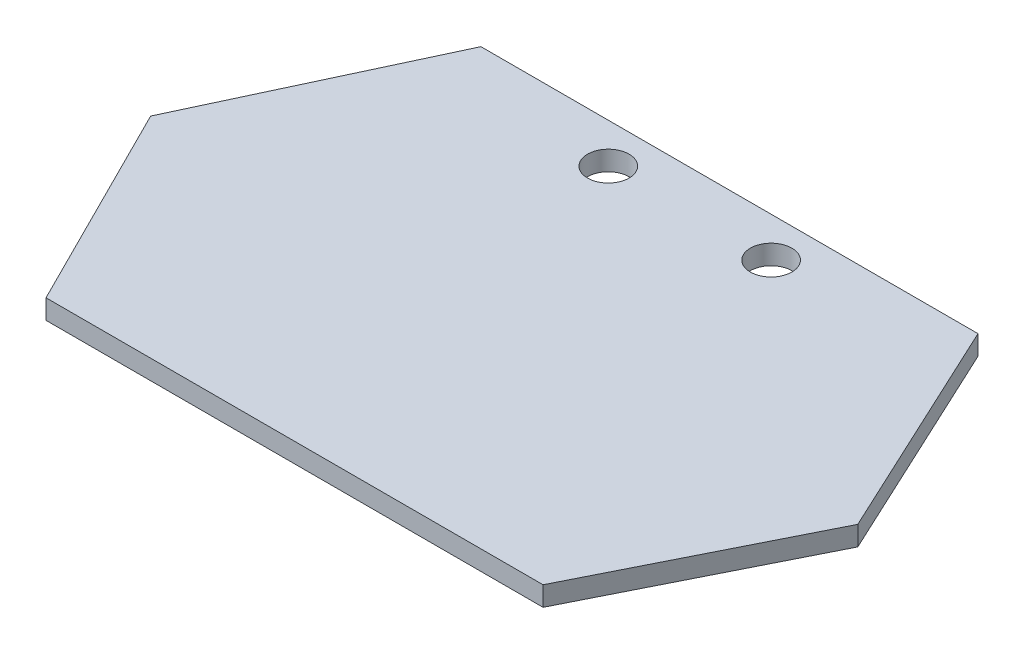
ISO-10303-21;
HEADER;
FILE_DESCRIPTION(('STEP AP214'),'2;1');
FILE_NAME('part.step','',(''),(''),'','','');
FILE_SCHEMA(('AUTOMOTIVE_DESIGN { 1 0 10303 214 1 1 1 1 }'));
ENDSEC;
DATA;
#1=APPLICATION_CONTEXT('core data for automotive mechanical design processes');
#2=APPLICATION_PROTOCOL_DEFINITION('international standard','automotive_design',2000,#1);
#3=PRODUCT_CONTEXT('',#1,'mechanical');
#4=PRODUCT('Part','Part','',(#3));
#5=PRODUCT_RELATED_PRODUCT_CATEGORY('part','',(#4));
#6=PRODUCT_DEFINITION_FORMATION('','',#4);
#7=PRODUCT_DEFINITION_CONTEXT('part definition',#1,'design');
#8=PRODUCT_DEFINITION('design','',#6,#7);
#9=PRODUCT_DEFINITION_SHAPE('','',#8);
#10=(LENGTH_UNIT() NAMED_UNIT(*) SI_UNIT(.MILLI.,.METRE.));
#11=(NAMED_UNIT(*) PLANE_ANGLE_UNIT() SI_UNIT($,.RADIAN.));
#12=(NAMED_UNIT(*) SI_UNIT($,.STERADIAN.) SOLID_ANGLE_UNIT());
#13=UNCERTAINTY_MEASURE_WITH_UNIT(LENGTH_MEASURE(1.E-05),#10,'distance_accuracy_value','');
#14=(GEOMETRIC_REPRESENTATION_CONTEXT(3) GLOBAL_UNCERTAINTY_ASSIGNED_CONTEXT((#13)) GLOBAL_UNIT_ASSIGNED_CONTEXT((#10,
#11,#12)) REPRESENTATION_CONTEXT('',''));
#15=CARTESIAN_POINT('',(0.,0.,0.));
#16=DIRECTION('',(0.,0.,1.));
#17=DIRECTION('',(1.,0.,0.));
#18=AXIS2_PLACEMENT_3D('',#15,#16,#17);
#19=CARTESIAN_POINT('',(0.,1.,0.));
#20=DIRECTION('',(0.,-1.,0.));
#21=DIRECTION('',(0.,0.,-1.));
#22=AXIS2_PLACEMENT_3D('',#19,#20,#21);
#23=PLANE('',#22);
#24=CARTESIAN_POINT('',(-3.78708882783882,1.,-12.6218461538462));
#25=DIRECTION('',(0.,1.,0.));
#26=DIRECTION('',(0.,0.,1.));
#27=AXIS2_PLACEMENT_3D('',#24,#25,#26);
#28=CIRCLE('',#27,1.06045);
#29=CARTESIAN_POINT('',(-3.78708882783882,1.,-11.5613961538462));
#30=VERTEX_POINT('',#29);
#31=EDGE_CURVE('E121',#30,#30,#28,.T.);
#32=ORIENTED_EDGE('',*,*,#31,.F.);
#33=EDGE_LOOP('',(#32));
#34=FACE_BOUND('',#33,.T.);
#35=DIRECTION('',(-0.422618261740698,0.,0.906307787036651));
#36=VECTOR('',#35,1.);
#37=CARTESIAN_POINT('',(-17.6950907519457,1.,-3.14373725848069));
#38=LINE('',#37,#36);
#39=CARTESIAN_POINT('',(-12.3278388278388,1.,-14.6538461538462));
#40=VERTEX_POINT('',#39);
#41=CARTESIAN_POINT('',(-17.6950907519457,1.,-3.14373725848069));
#42=VERTEX_POINT('',#41);
#43=EDGE_CURVE('E129',#40,#42,#38,.T.);
#44=ORIENTED_EDGE('',*,*,#43,.T.);
#45=DIRECTION('',(0.447868106614323,0.,0.89409963599014));
#46=VECTOR('',#45,1.);
#47=CARTESIAN_POINT('',(-12.3278388278388,1.,7.57115384615384));
#48=LINE('',#47,#46);
#49=CARTESIAN_POINT('',(-12.3278388278388,1.,7.57115384615384));
#50=VERTEX_POINT('',#49);
#51=EDGE_CURVE('E86',#42,#50,#48,.T.);
#52=ORIENTED_EDGE('',*,*,#51,.T.);
#53=DIRECTION('',(1.,0.,0.));
#54=VECTOR('',#53,1.);
#55=CARTESIAN_POINT('',(0.37216117216118,1.,7.57115384615384));
#56=LINE('',#55,#54);
#57=CARTESIAN_POINT('',(13.0721611721612,1.,7.57115384615384));
#58=VERTEX_POINT('',#57);
#59=EDGE_CURVE('E99',#50,#58,#56,.T.);
#60=ORIENTED_EDGE('',*,*,#59,.T.);
#61=DIRECTION('',(0.447868106614323,0.,-0.89409963599014));
#62=VECTOR('',#61,1.);
#63=CARTESIAN_POINT('',(18.439413096268,1.,-3.14373725848069));
#64=LINE('',#63,#62);
#65=CARTESIAN_POINT('',(18.439413096268,1.,-3.14373725848069));
#66=VERTEX_POINT('',#65);
#67=EDGE_CURVE('E93',#58,#66,#64,.T.);
#68=ORIENTED_EDGE('',*,*,#67,.T.);
#69=DIRECTION('',(-0.422618261740697,0.,-0.906307787036651));
#70=VECTOR('',#69,1.);
#71=CARTESIAN_POINT('',(13.0721611721612,1.,-14.6538461538462));
#72=LINE('',#71,#70);
#73=CARTESIAN_POINT('',(13.0721611721612,1.,-14.6538461538462));
#74=VERTEX_POINT('',#73);
#75=EDGE_CURVE('E97',#66,#74,#72,.T.);
#76=ORIENTED_EDGE('',*,*,#75,.T.);
#77=DIRECTION('',(-1.,0.,0.));
#78=VECTOR('',#77,1.);
#79=CARTESIAN_POINT('',(-12.3278388278388,1.,-14.6538461538462));
#80=LINE('',#79,#78);
#81=EDGE_CURVE('E49',#74,#40,#80,.T.);
#82=ORIENTED_EDGE('',*,*,#81,.T.);
#83=EDGE_LOOP('',(#44,#52,#60,#68,#76,#82));
#84=FACE_BOUND('',#83,.T.);
#85=CARTESIAN_POINT('',(4.53141117216118,1.,-12.6218461538462));
#86=DIRECTION('',(0.,1.,0.));
#87=DIRECTION('',(0.,0.,1.));
#88=AXIS2_PLACEMENT_3D('',#85,#86,#87);
#89=CIRCLE('',#88,1.06045);
#90=CARTESIAN_POINT('',(4.53141117216118,1.,-11.5613961538462));
#91=VERTEX_POINT('',#90);
#92=EDGE_CURVE('E172',#91,#91,#89,.T.);
#93=ORIENTED_EDGE('',*,*,#92,.F.);
#94=EDGE_LOOP('',(#93));
#95=FACE_BOUND('',#94,.T.);
#96=ADVANCED_FACE('F32',(#34,#84,#95),#23,.F.);
#97=CARTESIAN_POINT('',(0.,0.,0.));
#98=DIRECTION('',(0.,-1.,0.));
#99=DIRECTION('',(0.,0.,-1.));
#100=AXIS2_PLACEMENT_3D('',#97,#98,#99);
#101=PLANE('',#100);
#102=CARTESIAN_POINT('',(-3.78708882783882,0.,-12.6218461538462));
#103=DIRECTION('',(0.,1.,0.));
#104=DIRECTION('',(0.,0.,1.));
#105=AXIS2_PLACEMENT_3D('',#102,#103,#104);
#106=CIRCLE('',#105,1.06045);
#107=CARTESIAN_POINT('',(-3.78708882783882,0.,-11.5613961538462));
#108=VERTEX_POINT('',#107);
#109=EDGE_CURVE('E177',#108,#108,#106,.T.);
#110=ORIENTED_EDGE('',*,*,#109,.T.);
#111=EDGE_LOOP('',(#110));
#112=FACE_BOUND('',#111,.T.);
#113=DIRECTION('',(-0.422618261740698,0.,0.906307787036651));
#114=VECTOR('',#113,1.);
#115=CARTESIAN_POINT('',(-17.6950907519457,0.,-3.14373725848069));
#116=LINE('',#115,#114);
#117=CARTESIAN_POINT('',(-12.3278388278388,0.,-14.6538461538462));
#118=VERTEX_POINT('',#117);
#119=CARTESIAN_POINT('',(-17.6950907519457,0.,-3.14373725848069));
#120=VERTEX_POINT('',#119);
#121=EDGE_CURVE('E117',#118,#120,#116,.T.);
#122=ORIENTED_EDGE('',*,*,#121,.F.);
#123=DIRECTION('',(-1.,0.,0.));
#124=VECTOR('',#123,1.);
#125=CARTESIAN_POINT('',(-12.3278388278388,0.,-14.6538461538462));
#126=LINE('',#125,#124);
#127=CARTESIAN_POINT('',(13.0721611721612,0.,-14.6538461538462));
#128=VERTEX_POINT('',#127);
#129=EDGE_CURVE('E78',#128,#118,#126,.T.);
#130=ORIENTED_EDGE('',*,*,#129,.F.);
#131=DIRECTION('',(-0.422618261740697,0.,-0.906307787036651));
#132=VECTOR('',#131,1.);
#133=CARTESIAN_POINT('',(13.0721611721612,0.,-14.6538461538462));
#134=LINE('',#133,#132);
#135=CARTESIAN_POINT('',(18.439413096268,0.,-3.14373725848069));
#136=VERTEX_POINT('',#135);
#137=EDGE_CURVE('E72',#136,#128,#134,.T.);
#138=ORIENTED_EDGE('',*,*,#137,.F.);
#139=DIRECTION('',(0.447868106614323,0.,-0.89409963599014));
#140=VECTOR('',#139,1.);
#141=CARTESIAN_POINT('',(18.439413096268,0.,-3.14373725848069));
#142=LINE('',#141,#140);
#143=CARTESIAN_POINT('',(13.0721611721612,0.,7.57115384615384));
#144=VERTEX_POINT('',#143);
#145=EDGE_CURVE('E107',#144,#136,#142,.T.);
#146=ORIENTED_EDGE('',*,*,#145,.F.);
#147=DIRECTION('',(1.,0.,0.));
#148=VECTOR('',#147,1.);
#149=CARTESIAN_POINT('',(13.0721611721612,0.,7.57115384615384));
#150=LINE('',#149,#148);
#151=CARTESIAN_POINT('',(-12.3278388278388,0.,7.57115384615384));
#152=VERTEX_POINT('',#151);
#153=EDGE_CURVE('E124',#152,#144,#150,.T.);
#154=ORIENTED_EDGE('',*,*,#153,.F.);
#155=DIRECTION('',(0.447868106614323,0.,0.89409963599014));
#156=VECTOR('',#155,1.);
#157=CARTESIAN_POINT('',(-12.3278388278388,0.,7.57115384615384));
#158=LINE('',#157,#156);
#159=EDGE_CURVE('E120',#120,#152,#158,.T.);
#160=ORIENTED_EDGE('',*,*,#159,.F.);
#161=EDGE_LOOP('',(#122,#130,#138,#146,#154,#160));
#162=FACE_BOUND('',#161,.T.);
#163=CARTESIAN_POINT('',(4.53141117216118,0.,-12.6218461538462));
#164=DIRECTION('',(0.,1.,0.));
#165=DIRECTION('',(0.,0.,1.));
#166=AXIS2_PLACEMENT_3D('',#163,#164,#165);
#167=CIRCLE('',#166,1.06045);
#168=CARTESIAN_POINT('',(4.53141117216118,0.,-11.5613961538462));
#169=VERTEX_POINT('',#168);
#170=EDGE_CURVE('E175',#169,#169,#167,.T.);
#171=ORIENTED_EDGE('',*,*,#170,.T.);
#172=EDGE_LOOP('',(#171));
#173=FACE_BOUND('',#172,.T.);
#174=ADVANCED_FACE('F139',(#112,#162,#173),#101,.T.);
#175=CARTESIAN_POINT('',(-17.6950907519457,1.,-3.14373725848069));
#176=DIRECTION('',(0.906307787036651,0.,0.422618261740698));
#177=DIRECTION('',(0.422618261740698,0.,-0.906307787036651));
#178=AXIS2_PLACEMENT_3D('',#175,#176,#177);
#179=PLANE('',#178);
#180=ORIENTED_EDGE('',*,*,#121,.T.);
#181=DIRECTION('',(0.,-1.,0.));
#182=VECTOR('',#181,1.);
#183=CARTESIAN_POINT('',(-17.6950907519457,1.,-3.14373725848069));
#184=LINE('',#183,#182);
#185=EDGE_CURVE('E11',#42,#120,#184,.T.);
#186=ORIENTED_EDGE('',*,*,#185,.F.);
#187=ORIENTED_EDGE('',*,*,#43,.F.);
#188=DIRECTION('',(0.,-1.,0.));
#189=VECTOR('',#188,1.);
#190=CARTESIAN_POINT('',(-12.3278388278388,1.,-14.6538461538462));
#191=LINE('',#190,#189);
#192=EDGE_CURVE('E113',#40,#118,#191,.T.);
#193=ORIENTED_EDGE('',*,*,#192,.T.);
#194=EDGE_LOOP('',(#180,#186,#187,#193));
#195=FACE_BOUND('',#194,.T.);
#196=ADVANCED_FACE('F34',(#195),#179,.F.);
#197=CARTESIAN_POINT('',(-12.3278388278388,1.,7.57115384615384));
#198=DIRECTION('',(0.89409963599014,0.,-0.447868106614323));
#199=DIRECTION('',(-0.447868106614323,0.,-0.89409963599014));
#200=AXIS2_PLACEMENT_3D('',#197,#198,#199);
#201=PLANE('',#200);
#202=ORIENTED_EDGE('',*,*,#159,.T.);
#203=DIRECTION('',(0.,-1.,0.));
#204=VECTOR('',#203,1.);
#205=CARTESIAN_POINT('',(-12.3278388278388,1.,7.57115384615384));
#206=LINE('',#205,#204);
#207=EDGE_CURVE('E41',#50,#152,#206,.T.);
#208=ORIENTED_EDGE('',*,*,#207,.F.);
#209=ORIENTED_EDGE('',*,*,#51,.F.);
#210=ORIENTED_EDGE('',*,*,#185,.T.);
#211=EDGE_LOOP('',(#202,#208,#209,#210));
#212=FACE_BOUND('',#211,.T.);
#213=ADVANCED_FACE('F135',(#212),#201,.F.);
#214=CARTESIAN_POINT('',(13.0721611721612,1.,7.57115384615384));
#215=DIRECTION('',(0.,0.,-1.));
#216=DIRECTION('',(-1.,0.,0.));
#217=AXIS2_PLACEMENT_3D('',#214,#215,#216);
#218=PLANE('',#217);
#219=ORIENTED_EDGE('',*,*,#153,.T.);
#220=DIRECTION('',(0.,-1.,0.));
#221=VECTOR('',#220,1.);
#222=CARTESIAN_POINT('',(13.0721611721612,1.,7.57115384615384));
#223=LINE('',#222,#221);
#224=EDGE_CURVE('E108',#58,#144,#223,.T.);
#225=ORIENTED_EDGE('',*,*,#224,.F.);
#226=ORIENTED_EDGE('',*,*,#59,.F.);
#227=ORIENTED_EDGE('',*,*,#207,.T.);
#228=EDGE_LOOP('',(#219,#225,#226,#227));
#229=FACE_BOUND('',#228,.T.);
#230=ADVANCED_FACE('F134',(#229),#218,.F.);
#231=CARTESIAN_POINT('',(18.439413096268,1.,-3.14373725848069));
#232=DIRECTION('',(-0.89409963599014,0.,-0.447868106614323));
#233=DIRECTION('',(-0.447868106614323,0.,0.89409963599014));
#234=AXIS2_PLACEMENT_3D('',#231,#232,#233);
#235=PLANE('',#234);
#236=ORIENTED_EDGE('',*,*,#145,.T.);
#237=DIRECTION('',(0.,-1.,0.));
#238=VECTOR('',#237,1.);
#239=CARTESIAN_POINT('',(18.439413096268,1.,-3.14373725848069));
#240=LINE('',#239,#238);
#241=EDGE_CURVE('E104',#66,#136,#240,.T.);
#242=ORIENTED_EDGE('',*,*,#241,.F.);
#243=ORIENTED_EDGE('',*,*,#67,.F.);
#244=ORIENTED_EDGE('',*,*,#224,.T.);
#245=EDGE_LOOP('',(#236,#242,#243,#244));
#246=FACE_BOUND('',#245,.T.);
#247=ADVANCED_FACE('F105',(#246),#235,.F.);
#248=CARTESIAN_POINT('',(13.0721611721612,1.,-14.6538461538462));
#249=DIRECTION('',(-0.906307787036651,0.,0.422618261740697));
#250=DIRECTION('',(0.422618261740697,0.,0.906307787036651));
#251=AXIS2_PLACEMENT_3D('',#248,#249,#250);
#252=PLANE('',#251);
#253=ORIENTED_EDGE('',*,*,#137,.T.);
#254=DIRECTION('',(0.,-1.,0.));
#255=VECTOR('',#254,1.);
#256=CARTESIAN_POINT('',(13.0721611721612,1.,-14.6538461538462));
#257=LINE('',#256,#255);
#258=EDGE_CURVE('E109',#74,#128,#257,.T.);
#259=ORIENTED_EDGE('',*,*,#258,.F.);
#260=ORIENTED_EDGE('',*,*,#75,.F.);
#261=ORIENTED_EDGE('',*,*,#241,.T.);
#262=EDGE_LOOP('',(#253,#259,#260,#261));
#263=FACE_BOUND('',#262,.T.);
#264=ADVANCED_FACE('F111',(#263),#252,.F.);
#265=CARTESIAN_POINT('',(-12.3278388278388,1.,-14.6538461538462));
#266=DIRECTION('',(0.,0.,1.));
#267=DIRECTION('',(1.,0.,0.));
#268=AXIS2_PLACEMENT_3D('',#265,#266,#267);
#269=PLANE('',#268);
#270=ORIENTED_EDGE('',*,*,#129,.T.);
#271=ORIENTED_EDGE('',*,*,#192,.F.);
#272=ORIENTED_EDGE('',*,*,#81,.F.);
#273=ORIENTED_EDGE('',*,*,#258,.T.);
#274=EDGE_LOOP('',(#270,#271,#272,#273));
#275=FACE_BOUND('',#274,.T.);
#276=ADVANCED_FACE('F143',(#275),#269,.F.);
#277=CARTESIAN_POINT('',(-3.78708882783882,1.,-12.6218461538462));
#278=DIRECTION('',(0.,-1.,0.));
#279=DIRECTION('',(0.,0.,-1.));
#280=AXIS2_PLACEMENT_3D('',#277,#278,#279);
#281=CYLINDRICAL_SURFACE('',#280,1.06045);
#282=ORIENTED_EDGE('',*,*,#31,.T.);
#283=EDGE_LOOP('',(#282));
#284=FACE_BOUND('',#283,.T.);
#285=ORIENTED_EDGE('',*,*,#109,.F.);
#286=EDGE_LOOP('',(#285));
#287=FACE_BOUND('',#286,.T.);
#288=ADVANCED_FACE('F145',(#284,#287),#281,.F.);
#289=CARTESIAN_POINT('',(4.53141117216118,1.,-12.6218461538462));
#290=DIRECTION('',(0.,-1.,0.));
#291=DIRECTION('',(0.,0.,-1.));
#292=AXIS2_PLACEMENT_3D('',#289,#290,#291);
#293=CYLINDRICAL_SURFACE('',#292,1.06045);
#294=ORIENTED_EDGE('',*,*,#92,.T.);
#295=EDGE_LOOP('',(#294));
#296=FACE_BOUND('',#295,.T.);
#297=ORIENTED_EDGE('',*,*,#170,.F.);
#298=EDGE_LOOP('',(#297));
#299=FACE_BOUND('',#298,.T.);
#300=ADVANCED_FACE('F151',(#296,#299),#293,.F.);
#301=CLOSED_SHELL('',(#96,#174,#196,#213,#230,#247,#264,#276,#288,#300));
#302=MANIFOLD_SOLID_BREP('B2',#301);
#303=ADVANCED_BREP_SHAPE_REPRESENTATION('',(#18,#302),#14);
#304=SHAPE_DEFINITION_REPRESENTATION(#9,#303);
ENDSEC;
END-ISO-10303-21;
